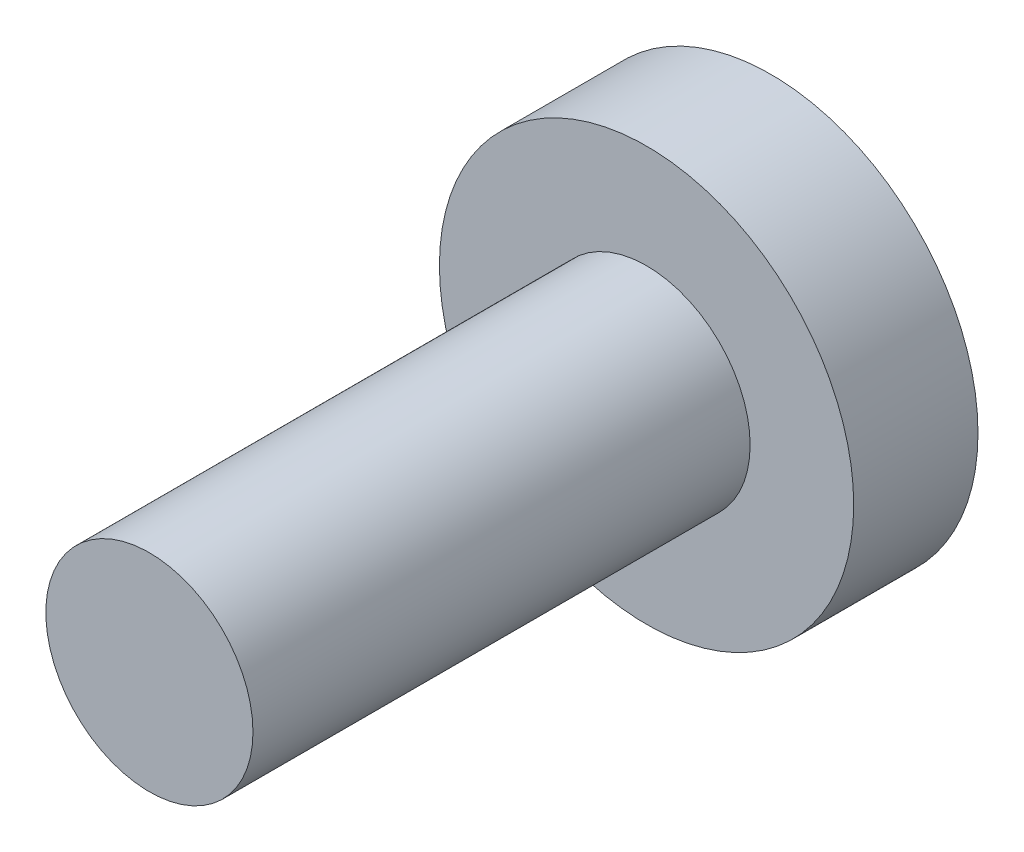
ISO-10303-21;
HEADER;
FILE_DESCRIPTION(('STEP AP214'),'2;1');
FILE_NAME('part.step','',(''),(''),'','','');
FILE_SCHEMA(('AUTOMOTIVE_DESIGN { 1 0 10303 214 1 1 1 1 }'));
ENDSEC;
DATA;
#1=APPLICATION_CONTEXT('core data for automotive mechanical design processes');
#2=APPLICATION_PROTOCOL_DEFINITION('international standard','automotive_design',2000,#1);
#3=PRODUCT_CONTEXT('',#1,'mechanical');
#4=PRODUCT('Part','Part','',(#3));
#5=PRODUCT_RELATED_PRODUCT_CATEGORY('part','',(#4));
#6=PRODUCT_DEFINITION_FORMATION('','',#4);
#7=PRODUCT_DEFINITION_CONTEXT('part definition',#1,'design');
#8=PRODUCT_DEFINITION('design','',#6,#7);
#9=PRODUCT_DEFINITION_SHAPE('','',#8);
#10=(LENGTH_UNIT() NAMED_UNIT(*) SI_UNIT(.MILLI.,.METRE.));
#11=(NAMED_UNIT(*) PLANE_ANGLE_UNIT() SI_UNIT($,.RADIAN.));
#12=(NAMED_UNIT(*) SI_UNIT($,.STERADIAN.) SOLID_ANGLE_UNIT());
#13=UNCERTAINTY_MEASURE_WITH_UNIT(LENGTH_MEASURE(1.E-05),#10,'distance_accuracy_value','');
#14=(GEOMETRIC_REPRESENTATION_CONTEXT(3) GLOBAL_UNCERTAINTY_ASSIGNED_CONTEXT((#13)) GLOBAL_UNIT_ASSIGNED_CONTEXT((#10,
#11,#12)) REPRESENTATION_CONTEXT('',''));
#15=CARTESIAN_POINT('',(0.,0.,0.));
#16=DIRECTION('',(0.,0.,1.));
#17=DIRECTION('',(1.,0.,0.));
#18=AXIS2_PLACEMENT_3D('',#15,#16,#17);
#19=CARTESIAN_POINT('',(0.,0.,6.));
#20=DIRECTION('',(0.,0.,-1.));
#21=DIRECTION('',(-1.,0.,0.));
#22=AXIS2_PLACEMENT_3D('',#19,#20,#21);
#23=CYLINDRICAL_SURFACE('',#22,1.25);
#24=CARTESIAN_POINT('',(0.,0.,6.));
#25=DIRECTION('',(0.,0.,1.));
#26=DIRECTION('',(1.,0.,0.));
#27=AXIS2_PLACEMENT_3D('',#24,#25,#26);
#28=CIRCLE('',#27,1.25);
#29=CARTESIAN_POINT('',(1.25,0.,6.));
#30=VERTEX_POINT('',#29);
#31=EDGE_CURVE('E11',#30,#30,#28,.T.);
#32=ORIENTED_EDGE('',*,*,#31,.F.);
#33=EDGE_LOOP('',(#32));
#34=FACE_BOUND('',#33,.T.);
#35=CARTESIAN_POINT('',(0.,0.,0.));
#36=DIRECTION('',(0.,0.,1.));
#37=DIRECTION('',(1.,0.,0.));
#38=AXIS2_PLACEMENT_3D('',#35,#36,#37);
#39=CIRCLE('',#38,1.25);
#40=CARTESIAN_POINT('',(1.25,0.,0.));
#41=VERTEX_POINT('',#40);
#42=EDGE_CURVE('E42',#41,#41,#39,.T.);
#43=ORIENTED_EDGE('',*,*,#42,.T.);
#44=EDGE_LOOP('',(#43));
#45=FACE_BOUND('',#44,.T.);
#46=ADVANCED_FACE('F39',(#34,#45),#23,.T.);
#47=CARTESIAN_POINT('',(0.,0.,6.));
#48=DIRECTION('',(0.,0.,1.));
#49=DIRECTION('',(1.,0.,0.));
#50=AXIS2_PLACEMENT_3D('',#47,#48,#49);
#51=PLANE('',#50);
#52=ORIENTED_EDGE('',*,*,#31,.T.);
#53=EDGE_LOOP('',(#52));
#54=FACE_BOUND('',#53,.T.);
#55=ADVANCED_FACE('F268',(#54),#51,.T.);
#56=CARTESIAN_POINT('',(0.,0.,-1.5));
#57=DIRECTION('',(0.,0.,1.));
#58=DIRECTION('',(1.,0.,0.));
#59=AXIS2_PLACEMENT_3D('',#56,#57,#58);
#60=CYLINDRICAL_SURFACE('',#59,2.5);
#61=CARTESIAN_POINT('',(0.,0.,-1.5));
#62=DIRECTION('',(0.,0.,-1.));
#63=DIRECTION('',(-1.,0.,0.));
#64=AXIS2_PLACEMENT_3D('',#61,#62,#63);
#65=CIRCLE('',#64,2.5);
#66=CARTESIAN_POINT('',(-2.5,0.,-1.5));
#67=VERTEX_POINT('',#66);
#68=EDGE_CURVE('E241',#67,#67,#65,.T.);
#69=ORIENTED_EDGE('',*,*,#68,.F.);
#70=EDGE_LOOP('',(#69));
#71=FACE_BOUND('',#70,.T.);
#72=CARTESIAN_POINT('',(0.,0.,0.));
#73=DIRECTION('',(0.,0.,-1.));
#74=DIRECTION('',(-1.,0.,0.));
#75=AXIS2_PLACEMENT_3D('',#72,#73,#74);
#76=CIRCLE('',#75,2.5);
#77=CARTESIAN_POINT('',(-2.5,0.,0.));
#78=VERTEX_POINT('',#77);
#79=EDGE_CURVE('E213',#78,#78,#76,.T.);
#80=ORIENTED_EDGE('',*,*,#79,.T.);
#81=EDGE_LOOP('',(#80));
#82=FACE_BOUND('',#81,.T.);
#83=ADVANCED_FACE('F249',(#71,#82),#60,.T.);
#84=CARTESIAN_POINT('',(0.,0.,-1.5));
#85=DIRECTION('',(0.,0.,-1.));
#86=DIRECTION('',(-1.,0.,0.));
#87=AXIS2_PLACEMENT_3D('',#84,#85,#86);
#88=PLANE('',#87);
#89=DIRECTION('',(0.,-1.,0.));
#90=VECTOR('',#89,1.);
#91=CARTESIAN_POINT('',(1.25,0.18,-1.5));
#92=LINE('',#91,#90);
#93=CARTESIAN_POINT('',(1.25,0.18,-1.5));
#94=VERTEX_POINT('',#93);
#95=CARTESIAN_POINT('',(1.25,-0.18,-1.5));
#96=VERTEX_POINT('',#95);
#97=EDGE_CURVE('E54',#94,#96,#92,.T.);
#98=ORIENTED_EDGE('',*,*,#97,.F.);
#99=DIRECTION('',(1.,0.,0.));
#100=VECTOR('',#99,1.);
#101=CARTESIAN_POINT('',(1.25,0.18,-1.5));
#102=LINE('',#101,#100);
#103=CARTESIAN_POINT('',(0.180000000000001,0.18,-1.5));
#104=VERTEX_POINT('',#103);
#105=EDGE_CURVE('E207',#104,#94,#102,.T.);
#106=ORIENTED_EDGE('',*,*,#105,.F.);
#107=DIRECTION('',(0.,-1.,0.));
#108=VECTOR('',#107,1.);
#109=CARTESIAN_POINT('',(0.180000000000005,1.25,-1.5));
#110=LINE('',#109,#108);
#111=CARTESIAN_POINT('',(0.180000000000005,1.25,-1.5));
#112=VERTEX_POINT('',#111);
#113=EDGE_CURVE('E204',#112,#104,#110,.T.);
#114=ORIENTED_EDGE('',*,*,#113,.F.);
#115=DIRECTION('',(1.,0.,0.));
#116=VECTOR('',#115,1.);
#117=CARTESIAN_POINT('',(0.180000000000005,1.25,-1.5));
#118=LINE('',#117,#116);
#119=CARTESIAN_POINT('',(-0.179999999999996,1.25,-1.5));
#120=VERTEX_POINT('',#119);
#121=EDGE_CURVE('E138',#120,#112,#118,.T.);
#122=ORIENTED_EDGE('',*,*,#121,.F.);
#123=DIRECTION('',(0.,1.,0.));
#124=VECTOR('',#123,1.);
#125=CARTESIAN_POINT('',(-0.179999999999996,1.25,-1.5));
#126=LINE('',#125,#124);
#127=CARTESIAN_POINT('',(-0.179999999999999,0.18,-1.5));
#128=VERTEX_POINT('',#127);
#129=EDGE_CURVE('E198',#128,#120,#126,.T.);
#130=ORIENTED_EDGE('',*,*,#129,.F.);
#131=DIRECTION('',(1.,0.,0.));
#132=VECTOR('',#131,1.);
#133=CARTESIAN_POINT('',(-0.179999999999999,0.18,-1.5));
#134=LINE('',#133,#132);
#135=CARTESIAN_POINT('',(-1.25,0.18,-1.5));
#136=VERTEX_POINT('',#135);
#137=EDGE_CURVE('E194',#136,#128,#134,.T.);
#138=ORIENTED_EDGE('',*,*,#137,.F.);
#139=DIRECTION('',(0.,1.,0.));
#140=VECTOR('',#139,1.);
#141=CARTESIAN_POINT('',(-1.25,0.18,-1.5));
#142=LINE('',#141,#140);
#143=CARTESIAN_POINT('',(-1.25,-0.18,-1.5));
#144=VERTEX_POINT('',#143);
#145=EDGE_CURVE('E190',#144,#136,#142,.T.);
#146=ORIENTED_EDGE('',*,*,#145,.F.);
#147=DIRECTION('',(-1.,0.,0.));
#148=VECTOR('',#147,1.);
#149=CARTESIAN_POINT('',(-0.180000000000001,-0.18,-1.5));
#150=LINE('',#149,#148);
#151=CARTESIAN_POINT('',(-0.180000000000001,-0.18,-1.5));
#152=VERTEX_POINT('',#151);
#153=EDGE_CURVE('E186',#152,#144,#150,.T.);
#154=ORIENTED_EDGE('',*,*,#153,.F.);
#155=DIRECTION('',(0.,1.,0.));
#156=VECTOR('',#155,1.);
#157=CARTESIAN_POINT('',(-0.180000000000001,-0.18,-1.5));
#158=LINE('',#157,#156);
#159=CARTESIAN_POINT('',(-0.180000000000005,-1.25,-1.5));
#160=VERTEX_POINT('',#159);
#161=EDGE_CURVE('E182',#160,#152,#158,.T.);
#162=ORIENTED_EDGE('',*,*,#161,.F.);
#163=DIRECTION('',(-1.,0.,0.));
#164=VECTOR('',#163,1.);
#165=CARTESIAN_POINT('',(0.179999999999995,-1.25,-1.5));
#166=LINE('',#165,#164);
#167=CARTESIAN_POINT('',(0.179999999999995,-1.25,-1.5));
#168=VERTEX_POINT('',#167);
#169=EDGE_CURVE('E178',#168,#160,#166,.T.);
#170=ORIENTED_EDGE('',*,*,#169,.F.);
#171=DIRECTION('',(0.,-1.,0.));
#172=VECTOR('',#171,1.);
#173=CARTESIAN_POINT('',(0.179999999999999,-0.18,-1.5));
#174=LINE('',#173,#172);
#175=CARTESIAN_POINT('',(0.179999999999999,-0.18,-1.5));
#176=VERTEX_POINT('',#175);
#177=EDGE_CURVE('E174',#176,#168,#174,.T.);
#178=ORIENTED_EDGE('',*,*,#177,.F.);
#179=DIRECTION('',(-1.,0.,0.));
#180=VECTOR('',#179,1.);
#181=CARTESIAN_POINT('',(1.25,-0.18,-1.5));
#182=LINE('',#181,#180);
#183=EDGE_CURVE('E170',#96,#176,#182,.T.);
#184=ORIENTED_EDGE('',*,*,#183,.F.);
#185=EDGE_LOOP('',(#98,#106,#114,#122,#130,#138,#146,#154,#162,#170,#178,#184));
#186=FACE_BOUND('',#185,.T.);
#187=ORIENTED_EDGE('',*,*,#68,.T.);
#188=EDGE_LOOP('',(#187));
#189=FACE_BOUND('',#188,.T.);
#190=ADVANCED_FACE('F254',(#186,#189),#88,.T.);
#191=CARTESIAN_POINT('',(0.,0.,0.));
#192=DIRECTION('',(0.,0.,-1.));
#193=DIRECTION('',(-1.,0.,0.));
#194=AXIS2_PLACEMENT_3D('',#191,#192,#193);
#195=PLANE('',#194);
#196=ORIENTED_EDGE('',*,*,#42,.F.);
#197=EDGE_LOOP('',(#196));
#198=FACE_BOUND('',#197,.T.);
#199=ORIENTED_EDGE('',*,*,#79,.F.);
#200=EDGE_LOOP('',(#199));
#201=FACE_BOUND('',#200,.T.);
#202=ADVANCED_FACE('F251',(#198,#201),#195,.F.);
#203=CARTESIAN_POINT('',(1.25,0.18,-1.));
#204=DIRECTION('',(1.,0.,0.));
#205=DIRECTION('',(0.,0.,-1.));
#206=AXIS2_PLACEMENT_3D('',#203,#204,#205);
#207=PLANE('',#206);
#208=ORIENTED_EDGE('',*,*,#97,.T.);
#209=DIRECTION('',(0.,0.,-1.));
#210=VECTOR('',#209,1.);
#211=CARTESIAN_POINT('',(1.25,-0.18,-1.));
#212=LINE('',#211,#210);
#213=CARTESIAN_POINT('',(1.25,-0.18,-1.));
#214=VERTEX_POINT('',#213);
#215=EDGE_CURVE('E102',#214,#96,#212,.T.);
#216=ORIENTED_EDGE('',*,*,#215,.F.);
#217=DIRECTION('',(0.,-1.,0.));
#218=VECTOR('',#217,1.);
#219=CARTESIAN_POINT('',(1.25,0.18,-1.));
#220=LINE('',#219,#218);
#221=CARTESIAN_POINT('',(1.25,0.18,-1.));
#222=VERTEX_POINT('',#221);
#223=EDGE_CURVE('E210',#222,#214,#220,.T.);
#224=ORIENTED_EDGE('',*,*,#223,.F.);
#225=DIRECTION('',(0.,0.,-1.));
#226=VECTOR('',#225,1.);
#227=CARTESIAN_POINT('',(1.25,0.18,-1.));
#228=LINE('',#227,#226);
#229=EDGE_CURVE('E62',#222,#94,#228,.T.);
#230=ORIENTED_EDGE('',*,*,#229,.T.);
#231=EDGE_LOOP('',(#208,#216,#224,#230));
#232=FACE_BOUND('',#231,.T.);
#233=ADVANCED_FACE('F253',(#232),#207,.F.);
#234=CARTESIAN_POINT('',(1.25,0.18,-1.));
#235=DIRECTION('',(0.,1.,0.));
#236=DIRECTION('',(-1.,0.,0.));
#237=AXIS2_PLACEMENT_3D('',#234,#235,#236);
#238=PLANE('',#237);
#239=ORIENTED_EDGE('',*,*,#105,.T.);
#240=ORIENTED_EDGE('',*,*,#229,.F.);
#241=DIRECTION('',(1.,0.,0.));
#242=VECTOR('',#241,1.);
#243=CARTESIAN_POINT('',(1.25,0.18,-1.));
#244=LINE('',#243,#242);
#245=CARTESIAN_POINT('',(0.180000000000001,0.18,-1.));
#246=VERTEX_POINT('',#245);
#247=EDGE_CURVE('E152',#246,#222,#244,.T.);
#248=ORIENTED_EDGE('',*,*,#247,.F.);
#249=DIRECTION('',(0.,0.,-1.));
#250=VECTOR('',#249,1.);
#251=CARTESIAN_POINT('',(0.180000000000001,0.18,-1.));
#252=LINE('',#251,#250);
#253=EDGE_CURVE('E143',#246,#104,#252,.T.);
#254=ORIENTED_EDGE('',*,*,#253,.T.);
#255=EDGE_LOOP('',(#239,#240,#248,#254));
#256=FACE_BOUND('',#255,.T.);
#257=ADVANCED_FACE('F261',(#256),#238,.F.);
#258=CARTESIAN_POINT('',(0.180000000000005,1.25,-1.));
#259=DIRECTION('',(1.,0.,0.));
#260=DIRECTION('',(0.,1.,0.));
#261=AXIS2_PLACEMENT_3D('',#258,#259,#260);
#262=PLANE('',#261);
#263=ORIENTED_EDGE('',*,*,#113,.T.);
#264=ORIENTED_EDGE('',*,*,#253,.F.);
#265=DIRECTION('',(0.,-1.,0.));
#266=VECTOR('',#265,1.);
#267=CARTESIAN_POINT('',(0.180000000000005,1.25,-1.));
#268=LINE('',#267,#266);
#269=CARTESIAN_POINT('',(0.180000000000005,1.25,-1.));
#270=VERTEX_POINT('',#269);
#271=EDGE_CURVE('E147',#270,#246,#268,.T.);
#272=ORIENTED_EDGE('',*,*,#271,.F.);
#273=DIRECTION('',(0.,0.,-1.));
#274=VECTOR('',#273,1.);
#275=CARTESIAN_POINT('',(0.180000000000005,1.25,-1.));
#276=LINE('',#275,#274);
#277=EDGE_CURVE('E131',#270,#112,#276,.T.);
#278=ORIENTED_EDGE('',*,*,#277,.T.);
#279=EDGE_LOOP('',(#263,#264,#272,#278));
#280=FACE_BOUND('',#279,.T.);
#281=ADVANCED_FACE('F148',(#280),#262,.F.);
#282=CARTESIAN_POINT('',(0.180000000000005,1.25,-1.));
#283=DIRECTION('',(0.,1.,0.));
#284=DIRECTION('',(-1.,0.,0.));
#285=AXIS2_PLACEMENT_3D('',#282,#283,#284);
#286=PLANE('',#285);
#287=ORIENTED_EDGE('',*,*,#121,.T.);
#288=ORIENTED_EDGE('',*,*,#277,.F.);
#289=DIRECTION('',(1.,0.,0.));
#290=VECTOR('',#289,1.);
#291=CARTESIAN_POINT('',(0.180000000000005,1.25,-1.));
#292=LINE('',#291,#290);
#293=CARTESIAN_POINT('',(-0.179999999999996,1.25,-1.));
#294=VERTEX_POINT('',#293);
#295=EDGE_CURVE('E135',#294,#270,#292,.T.);
#296=ORIENTED_EDGE('',*,*,#295,.F.);
#297=DIRECTION('',(0.,0.,-1.));
#298=VECTOR('',#297,1.);
#299=CARTESIAN_POINT('',(-0.179999999999996,1.25,-1.));
#300=LINE('',#299,#298);
#301=EDGE_CURVE('E144',#294,#120,#300,.T.);
#302=ORIENTED_EDGE('',*,*,#301,.T.);
#303=EDGE_LOOP('',(#287,#288,#296,#302));
#304=FACE_BOUND('',#303,.T.);
#305=ADVANCED_FACE('F133',(#304),#286,.F.);
#306=CARTESIAN_POINT('',(-0.179999999999996,1.25,-1.));
#307=DIRECTION('',(-1.,0.,0.));
#308=DIRECTION('',(0.,-1.,0.));
#309=AXIS2_PLACEMENT_3D('',#306,#307,#308);
#310=PLANE('',#309);
#311=ORIENTED_EDGE('',*,*,#129,.T.);
#312=ORIENTED_EDGE('',*,*,#301,.F.);
#313=DIRECTION('',(0.,1.,0.));
#314=VECTOR('',#313,1.);
#315=CARTESIAN_POINT('',(-0.179999999999996,1.25,-1.));
#316=LINE('',#315,#314);
#317=CARTESIAN_POINT('',(-0.179999999999999,0.18,-1.));
#318=VERTEX_POINT('',#317);
#319=EDGE_CURVE('E158',#318,#294,#316,.T.);
#320=ORIENTED_EDGE('',*,*,#319,.F.);
#321=DIRECTION('',(0.,0.,-1.));
#322=VECTOR('',#321,1.);
#323=CARTESIAN_POINT('',(-0.179999999999999,0.18,-1.));
#324=LINE('',#323,#322);
#325=EDGE_CURVE('E218',#318,#128,#324,.T.);
#326=ORIENTED_EDGE('',*,*,#325,.T.);
#327=EDGE_LOOP('',(#311,#312,#320,#326));
#328=FACE_BOUND('',#327,.T.);
#329=ADVANCED_FACE('F323',(#328),#310,.F.);
#330=CARTESIAN_POINT('',(-0.179999999999999,0.18,-1.));
#331=DIRECTION('',(0.,1.,0.));
#332=DIRECTION('',(-1.,0.,0.));
#333=AXIS2_PLACEMENT_3D('',#330,#331,#332);
#334=PLANE('',#333);
#335=ORIENTED_EDGE('',*,*,#137,.T.);
#336=ORIENTED_EDGE('',*,*,#325,.F.);
#337=DIRECTION('',(1.,0.,0.));
#338=VECTOR('',#337,1.);
#339=CARTESIAN_POINT('',(-0.179999999999999,0.18,-1.));
#340=LINE('',#339,#338);
#341=CARTESIAN_POINT('',(-1.25,0.18,-1.));
#342=VERTEX_POINT('',#341);
#343=EDGE_CURVE('E162',#342,#318,#340,.T.);
#344=ORIENTED_EDGE('',*,*,#343,.F.);
#345=DIRECTION('',(0.,0.,-1.));
#346=VECTOR('',#345,1.);
#347=CARTESIAN_POINT('',(-1.25,0.18,-1.));
#348=LINE('',#347,#346);
#349=EDGE_CURVE('E221',#342,#136,#348,.T.);
#350=ORIENTED_EDGE('',*,*,#349,.T.);
#351=EDGE_LOOP('',(#335,#336,#344,#350));
#352=FACE_BOUND('',#351,.T.);
#353=ADVANCED_FACE('F332',(#352),#334,.F.);
#354=CARTESIAN_POINT('',(-1.25,0.18,-1.));
#355=DIRECTION('',(-1.,0.,0.));
#356=DIRECTION('',(0.,0.,1.));
#357=AXIS2_PLACEMENT_3D('',#354,#355,#356);
#358=PLANE('',#357);
#359=ORIENTED_EDGE('',*,*,#145,.T.);
#360=ORIENTED_EDGE('',*,*,#349,.F.);
#361=DIRECTION('',(0.,1.,0.));
#362=VECTOR('',#361,1.);
#363=CARTESIAN_POINT('',(-1.25,0.18,-1.));
#364=LINE('',#363,#362);
#365=CARTESIAN_POINT('',(-1.25,-0.18,-1.));
#366=VERTEX_POINT('',#365);
#367=EDGE_CURVE('E443',#366,#342,#364,.T.);
#368=ORIENTED_EDGE('',*,*,#367,.F.);
#369=DIRECTION('',(0.,0.,-1.));
#370=VECTOR('',#369,1.);
#371=CARTESIAN_POINT('',(-1.25,-0.18,-1.));
#372=LINE('',#371,#370);
#373=EDGE_CURVE('E224',#366,#144,#372,.T.);
#374=ORIENTED_EDGE('',*,*,#373,.T.);
#375=EDGE_LOOP('',(#359,#360,#368,#374));
#376=FACE_BOUND('',#375,.T.);
#377=ADVANCED_FACE('F342',(#376),#358,.F.);
#378=CARTESIAN_POINT('',(-0.180000000000001,-0.18,-1.));
#379=DIRECTION('',(0.,-1.,0.));
#380=DIRECTION('',(0.,0.,-1.));
#381=AXIS2_PLACEMENT_3D('',#378,#379,#380);
#382=PLANE('',#381);
#383=ORIENTED_EDGE('',*,*,#153,.T.);
#384=ORIENTED_EDGE('',*,*,#373,.F.);
#385=DIRECTION('',(-1.,0.,0.));
#386=VECTOR('',#385,1.);
#387=CARTESIAN_POINT('',(-0.180000000000001,-0.18,-1.));
#388=LINE('',#387,#386);
#389=CARTESIAN_POINT('',(-0.180000000000001,-0.18,-1.));
#390=VERTEX_POINT('',#389);
#391=EDGE_CURVE('E439',#390,#366,#388,.T.);
#392=ORIENTED_EDGE('',*,*,#391,.F.);
#393=DIRECTION('',(0.,0.,-1.));
#394=VECTOR('',#393,1.);
#395=CARTESIAN_POINT('',(-0.180000000000001,-0.18,-1.));
#396=LINE('',#395,#394);
#397=EDGE_CURVE('E227',#390,#152,#396,.T.);
#398=ORIENTED_EDGE('',*,*,#397,.T.);
#399=EDGE_LOOP('',(#383,#384,#392,#398));
#400=FACE_BOUND('',#399,.T.);
#401=ADVANCED_FACE('F352',(#400),#382,.F.);
#402=CARTESIAN_POINT('',(-0.180000000000001,-0.18,-1.));
#403=DIRECTION('',(-1.,0.,0.));
#404=DIRECTION('',(0.,-1.,0.));
#405=AXIS2_PLACEMENT_3D('',#402,#403,#404);
#406=PLANE('',#405);
#407=ORIENTED_EDGE('',*,*,#161,.T.);
#408=ORIENTED_EDGE('',*,*,#397,.F.);
#409=DIRECTION('',(0.,1.,0.));
#410=VECTOR('',#409,1.);
#411=CARTESIAN_POINT('',(-0.180000000000001,-0.18,-1.));
#412=LINE('',#411,#410);
#413=CARTESIAN_POINT('',(-0.180000000000005,-1.25,-1.));
#414=VERTEX_POINT('',#413);
#415=EDGE_CURVE('E435',#414,#390,#412,.T.);
#416=ORIENTED_EDGE('',*,*,#415,.F.);
#417=DIRECTION('',(0.,0.,-1.));
#418=VECTOR('',#417,1.);
#419=CARTESIAN_POINT('',(-0.180000000000005,-1.25,-1.));
#420=LINE('',#419,#418);
#421=EDGE_CURVE('E230',#414,#160,#420,.T.);
#422=ORIENTED_EDGE('',*,*,#421,.T.);
#423=EDGE_LOOP('',(#407,#408,#416,#422));
#424=FACE_BOUND('',#423,.T.);
#425=ADVANCED_FACE('F362',(#424),#406,.F.);
#426=CARTESIAN_POINT('',(0.179999999999995,-1.25,-1.));
#427=DIRECTION('',(0.,-1.,0.));
#428=DIRECTION('',(1.,0.,0.));
#429=AXIS2_PLACEMENT_3D('',#426,#427,#428);
#430=PLANE('',#429);
#431=ORIENTED_EDGE('',*,*,#169,.T.);
#432=ORIENTED_EDGE('',*,*,#421,.F.);
#433=DIRECTION('',(-1.,0.,0.));
#434=VECTOR('',#433,1.);
#435=CARTESIAN_POINT('',(0.179999999999995,-1.25,-1.));
#436=LINE('',#435,#434);
#437=CARTESIAN_POINT('',(0.179999999999995,-1.25,-1.));
#438=VERTEX_POINT('',#437);
#439=EDGE_CURVE('E425',#438,#414,#436,.T.);
#440=ORIENTED_EDGE('',*,*,#439,.F.);
#441=DIRECTION('',(0.,0.,-1.));
#442=VECTOR('',#441,1.);
#443=CARTESIAN_POINT('',(0.179999999999995,-1.25,-1.));
#444=LINE('',#443,#442);
#445=EDGE_CURVE('E233',#438,#168,#444,.T.);
#446=ORIENTED_EDGE('',*,*,#445,.T.);
#447=EDGE_LOOP('',(#431,#432,#440,#446));
#448=FACE_BOUND('',#447,.T.);
#449=ADVANCED_FACE('F372',(#448),#430,.F.);
#450=CARTESIAN_POINT('',(0.179999999999999,-0.18,-1.));
#451=DIRECTION('',(1.,0.,0.));
#452=DIRECTION('',(0.,1.,0.));
#453=AXIS2_PLACEMENT_3D('',#450,#451,#452);
#454=PLANE('',#453);
#455=ORIENTED_EDGE('',*,*,#177,.T.);
#456=ORIENTED_EDGE('',*,*,#445,.F.);
#457=DIRECTION('',(0.,-1.,0.));
#458=VECTOR('',#457,1.);
#459=CARTESIAN_POINT('',(0.179999999999999,-0.18,-1.));
#460=LINE('',#459,#458);
#461=CARTESIAN_POINT('',(0.179999999999999,-0.18,-1.));
#462=VERTEX_POINT('',#461);
#463=EDGE_CURVE('E421',#462,#438,#460,.T.);
#464=ORIENTED_EDGE('',*,*,#463,.F.);
#465=DIRECTION('',(0.,0.,-1.));
#466=VECTOR('',#465,1.);
#467=CARTESIAN_POINT('',(0.179999999999999,-0.18,-1.));
#468=LINE('',#467,#466);
#469=EDGE_CURVE('E236',#462,#176,#468,.T.);
#470=ORIENTED_EDGE('',*,*,#469,.T.);
#471=EDGE_LOOP('',(#455,#456,#464,#470));
#472=FACE_BOUND('',#471,.T.);
#473=ADVANCED_FACE('F382',(#472),#454,.F.);
#474=CARTESIAN_POINT('',(1.25,-0.18,-1.));
#475=DIRECTION('',(0.,-1.,0.));
#476=DIRECTION('',(0.,0.,-1.));
#477=AXIS2_PLACEMENT_3D('',#474,#475,#476);
#478=PLANE('',#477);
#479=ORIENTED_EDGE('',*,*,#183,.T.);
#480=ORIENTED_EDGE('',*,*,#469,.F.);
#481=DIRECTION('',(-1.,0.,0.));
#482=VECTOR('',#481,1.);
#483=CARTESIAN_POINT('',(1.25,-0.18,-1.));
#484=LINE('',#483,#482);
#485=EDGE_CURVE('E426',#214,#462,#484,.T.);
#486=ORIENTED_EDGE('',*,*,#485,.F.);
#487=ORIENTED_EDGE('',*,*,#215,.T.);
#488=EDGE_LOOP('',(#479,#480,#486,#487));
#489=FACE_BOUND('',#488,.T.);
#490=ADVANCED_FACE('F392',(#489),#478,.F.);
#491=CARTESIAN_POINT('',(0.,0.,-1.));
#492=DIRECTION('',(0.,0.,-1.));
#493=DIRECTION('',(-1.,0.,0.));
#494=AXIS2_PLACEMENT_3D('',#491,#492,#493);
#495=PLANE('',#494);
#496=ORIENTED_EDGE('',*,*,#223,.T.);
#497=ORIENTED_EDGE('',*,*,#485,.T.);
#498=ORIENTED_EDGE('',*,*,#463,.T.);
#499=ORIENTED_EDGE('',*,*,#439,.T.);
#500=ORIENTED_EDGE('',*,*,#415,.T.);
#501=ORIENTED_EDGE('',*,*,#391,.T.);
#502=ORIENTED_EDGE('',*,*,#367,.T.);
#503=ORIENTED_EDGE('',*,*,#343,.T.);
#504=ORIENTED_EDGE('',*,*,#319,.T.);
#505=ORIENTED_EDGE('',*,*,#295,.T.);
#506=ORIENTED_EDGE('',*,*,#271,.T.);
#507=ORIENTED_EDGE('',*,*,#247,.T.);
#508=EDGE_LOOP('',(#496,#497,#498,#499,#500,#501,#502,#503,#504,#505,#506,#507));
#509=FACE_BOUND('',#508,.T.);
#510=ADVANCED_FACE('F155',(#509),#495,.T.);
#511=CLOSED_SHELL('',(#46,#55,#83,#190,#202,#233,#257,#281,#305,#329,#353,#377,#401,#425,#449,
#473,#490,#510));
#512=MANIFOLD_SOLID_BREP('B2',#511);
#513=ADVANCED_BREP_SHAPE_REPRESENTATION('',(#18,#512),#14);
#514=SHAPE_DEFINITION_REPRESENTATION(#9,#513);
ENDSEC;
END-ISO-10303-21;
